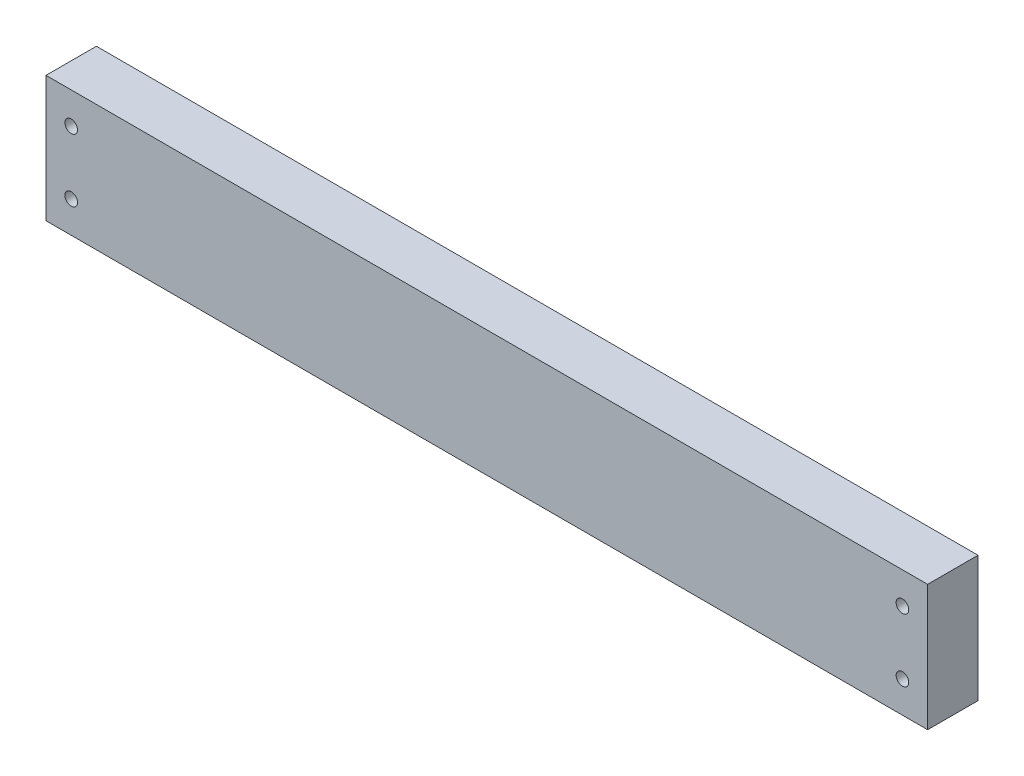
ISO-10303-21;
HEADER;
FILE_DESCRIPTION(('STEP AP214'),'2;1');
FILE_NAME('part.step','',(''),(''),'','','');
FILE_SCHEMA(('AUTOMOTIVE_DESIGN { 1 0 10303 214 1 1 1 1 }'));
ENDSEC;
DATA;
#1=APPLICATION_CONTEXT('core data for automotive mechanical design processes');
#2=APPLICATION_PROTOCOL_DEFINITION('international standard','automotive_design',2000,#1);
#3=PRODUCT_CONTEXT('',#1,'mechanical');
#4=PRODUCT('Part','Part','',(#3));
#5=PRODUCT_RELATED_PRODUCT_CATEGORY('part','',(#4));
#6=PRODUCT_DEFINITION_FORMATION('','',#4);
#7=PRODUCT_DEFINITION_CONTEXT('part definition',#1,'design');
#8=PRODUCT_DEFINITION('design','',#6,#7);
#9=PRODUCT_DEFINITION_SHAPE('','',#8);
#10=(LENGTH_UNIT() NAMED_UNIT(*) SI_UNIT(.MILLI.,.METRE.));
#11=(NAMED_UNIT(*) PLANE_ANGLE_UNIT() SI_UNIT($,.RADIAN.));
#12=(NAMED_UNIT(*) SI_UNIT($,.STERADIAN.) SOLID_ANGLE_UNIT());
#13=UNCERTAINTY_MEASURE_WITH_UNIT(LENGTH_MEASURE(1.E-05),#10,'distance_accuracy_value','');
#14=(GEOMETRIC_REPRESENTATION_CONTEXT(3) GLOBAL_UNCERTAINTY_ASSIGNED_CONTEXT((#13)) GLOBAL_UNIT_ASSIGNED_CONTEXT((#10,
#11,#12)) REPRESENTATION_CONTEXT('',''));
#15=CARTESIAN_POINT('',(0.,0.,0.));
#16=DIRECTION('',(0.,0.,1.));
#17=DIRECTION('',(1.,0.,0.));
#18=AXIS2_PLACEMENT_3D('',#15,#16,#17);
#19=CARTESIAN_POINT('',(350.,25.,-10.));
#20=DIRECTION('',(0.,0.,1.));
#21=DIRECTION('',(0.,-1.,0.));
#22=AXIS2_PLACEMENT_3D('',#19,#20,#21);
#23=PLANE('',#22);
#24=CARTESIAN_POINT('',(10.,12.5,-10.));
#25=DIRECTION('',(0.,0.,1.));
#26=DIRECTION('',(1.,0.,0.));
#27=AXIS2_PLACEMENT_3D('',#24,#25,#26);
#28=CIRCLE('',#27,2.5);
#29=CARTESIAN_POINT('',(12.5,12.5,-10.));
#30=VERTEX_POINT('',#29);
#31=EDGE_CURVE('E112',#30,#30,#28,.T.);
#32=ORIENTED_EDGE('',*,*,#31,.T.);
#33=EDGE_LOOP('',(#32));
#34=FACE_BOUND('',#33,.T.);
#35=CARTESIAN_POINT('',(340.,-12.5,-10.));
#36=DIRECTION('',(0.,0.,1.));
#37=DIRECTION('',(1.,0.,0.));
#38=AXIS2_PLACEMENT_3D('',#35,#36,#37);
#39=CIRCLE('',#38,2.50000000000002);
#40=CARTESIAN_POINT('',(342.5,-12.5,-10.));
#41=VERTEX_POINT('',#40);
#42=EDGE_CURVE('E124',#41,#41,#39,.T.);
#43=ORIENTED_EDGE('',*,*,#42,.T.);
#44=EDGE_LOOP('',(#43));
#45=FACE_BOUND('',#44,.T.);
#46=CARTESIAN_POINT('',(340.,12.5,-10.));
#47=DIRECTION('',(0.,0.,1.));
#48=DIRECTION('',(1.,0.,0.));
#49=AXIS2_PLACEMENT_3D('',#46,#47,#48);
#50=CIRCLE('',#49,2.50000000000002);
#51=CARTESIAN_POINT('',(342.5,12.5,-10.));
#52=VERTEX_POINT('',#51);
#53=EDGE_CURVE('E118',#52,#52,#50,.T.);
#54=ORIENTED_EDGE('',*,*,#53,.T.);
#55=EDGE_LOOP('',(#54));
#56=FACE_BOUND('',#55,.T.);
#57=CARTESIAN_POINT('',(10.,-12.5,-10.));
#58=DIRECTION('',(0.,0.,1.));
#59=DIRECTION('',(1.,0.,0.));
#60=AXIS2_PLACEMENT_3D('',#57,#58,#59);
#61=CIRCLE('',#60,2.5);
#62=CARTESIAN_POINT('',(12.5,-12.5,-10.));
#63=VERTEX_POINT('',#62);
#64=EDGE_CURVE('E98',#63,#63,#61,.T.);
#65=ORIENTED_EDGE('',*,*,#64,.T.);
#66=EDGE_LOOP('',(#65));
#67=FACE_BOUND('',#66,.T.);
#68=DIRECTION('',(0.,1.,0.));
#69=VECTOR('',#68,1.);
#70=CARTESIAN_POINT('',(0.,25.,-10.));
#71=LINE('',#70,#69);
#72=CARTESIAN_POINT('',(0.,-25.,-10.));
#73=VERTEX_POINT('',#72);
#74=CARTESIAN_POINT('',(0.,25.,-10.));
#75=VERTEX_POINT('',#74);
#76=EDGE_CURVE('E95',#73,#75,#71,.T.);
#77=ORIENTED_EDGE('',*,*,#76,.T.);
#78=DIRECTION('',(-1.,0.,0.));
#79=VECTOR('',#78,1.);
#80=CARTESIAN_POINT('',(350.,25.,-10.));
#81=LINE('',#80,#79);
#82=CARTESIAN_POINT('',(350.,25.,-10.));
#83=VERTEX_POINT('',#82);
#84=EDGE_CURVE('E11',#83,#75,#81,.T.);
#85=ORIENTED_EDGE('',*,*,#84,.F.);
#86=DIRECTION('',(0.,1.,0.));
#87=VECTOR('',#86,1.);
#88=CARTESIAN_POINT('',(350.,25.,-10.));
#89=LINE('',#88,#87);
#90=CARTESIAN_POINT('',(350.,-25.,-10.));
#91=VERTEX_POINT('',#90);
#92=EDGE_CURVE('E83',#91,#83,#89,.T.);
#93=ORIENTED_EDGE('',*,*,#92,.F.);
#94=DIRECTION('',(-1.,0.,0.));
#95=VECTOR('',#94,1.);
#96=CARTESIAN_POINT('',(350.,-25.,-10.));
#97=LINE('',#96,#95);
#98=EDGE_CURVE('E91',#91,#73,#97,.T.);
#99=ORIENTED_EDGE('',*,*,#98,.T.);
#100=EDGE_LOOP('',(#77,#85,#93,#99));
#101=FACE_BOUND('',#100,.T.);
#102=ADVANCED_FACE('F32',(#34,#45,#56,#67,#101),#23,.F.);
#103=CARTESIAN_POINT('',(350.,25.,10.));
#104=DIRECTION('',(0.,-1.,0.));
#105=DIRECTION('',(0.,0.,-1.));
#106=AXIS2_PLACEMENT_3D('',#103,#104,#105);
#107=PLANE('',#106);
#108=DIRECTION('',(0.,0.,1.));
#109=VECTOR('',#108,1.);
#110=CARTESIAN_POINT('',(0.,25.,10.));
#111=LINE('',#110,#109);
#112=CARTESIAN_POINT('',(0.,25.,10.));
#113=VERTEX_POINT('',#112);
#114=EDGE_CURVE('E87',#75,#113,#111,.T.);
#115=ORIENTED_EDGE('',*,*,#114,.T.);
#116=DIRECTION('',(-1.,0.,0.));
#117=VECTOR('',#116,1.);
#118=CARTESIAN_POINT('',(350.,25.,10.));
#119=LINE('',#118,#117);
#120=CARTESIAN_POINT('',(350.,25.,10.));
#121=VERTEX_POINT('',#120);
#122=EDGE_CURVE('E40',#121,#113,#119,.T.);
#123=ORIENTED_EDGE('',*,*,#122,.F.);
#124=DIRECTION('',(0.,0.,1.));
#125=VECTOR('',#124,1.);
#126=CARTESIAN_POINT('',(350.,25.,10.));
#127=LINE('',#126,#125);
#128=EDGE_CURVE('E78',#83,#121,#127,.T.);
#129=ORIENTED_EDGE('',*,*,#128,.F.);
#130=ORIENTED_EDGE('',*,*,#84,.T.);
#131=EDGE_LOOP('',(#115,#123,#129,#130));
#132=FACE_BOUND('',#131,.T.);
#133=ADVANCED_FACE('F86',(#132),#107,.F.);
#134=CARTESIAN_POINT('',(350.,25.,10.));
#135=DIRECTION('',(0.,0.,-1.));
#136=DIRECTION('',(0.,1.,0.));
#137=AXIS2_PLACEMENT_3D('',#134,#135,#136);
#138=PLANE('',#137);
#139=CARTESIAN_POINT('',(10.,12.5,10.));
#140=DIRECTION('',(0.,0.,1.));
#141=DIRECTION('',(1.,0.,0.));
#142=AXIS2_PLACEMENT_3D('',#139,#140,#141);
#143=CIRCLE('',#142,2.5);
#144=CARTESIAN_POINT('',(12.5,12.5,10.));
#145=VERTEX_POINT('',#144);
#146=EDGE_CURVE('E127',#145,#145,#143,.T.);
#147=ORIENTED_EDGE('',*,*,#146,.F.);
#148=EDGE_LOOP('',(#147));
#149=FACE_BOUND('',#148,.T.);
#150=CARTESIAN_POINT('',(340.,-12.5,10.));
#151=DIRECTION('',(0.,0.,1.));
#152=DIRECTION('',(1.,0.,0.));
#153=AXIS2_PLACEMENT_3D('',#150,#151,#152);
#154=CIRCLE('',#153,2.50000000000002);
#155=CARTESIAN_POINT('',(342.5,-12.5,10.));
#156=VERTEX_POINT('',#155);
#157=EDGE_CURVE('E121',#156,#156,#154,.T.);
#158=ORIENTED_EDGE('',*,*,#157,.F.);
#159=EDGE_LOOP('',(#158));
#160=FACE_BOUND('',#159,.T.);
#161=CARTESIAN_POINT('',(340.,12.5,10.));
#162=DIRECTION('',(0.,0.,1.));
#163=DIRECTION('',(1.,0.,0.));
#164=AXIS2_PLACEMENT_3D('',#161,#162,#163);
#165=CIRCLE('',#164,2.50000000000002);
#166=CARTESIAN_POINT('',(342.5,12.5,10.));
#167=VERTEX_POINT('',#166);
#168=EDGE_CURVE('E115',#167,#167,#165,.T.);
#169=ORIENTED_EDGE('',*,*,#168,.F.);
#170=EDGE_LOOP('',(#169));
#171=FACE_BOUND('',#170,.T.);
#172=CARTESIAN_POINT('',(10.,-12.5,10.));
#173=DIRECTION('',(0.,0.,1.));
#174=DIRECTION('',(1.,0.,0.));
#175=AXIS2_PLACEMENT_3D('',#172,#173,#174);
#176=CIRCLE('',#175,2.5);
#177=CARTESIAN_POINT('',(12.5,-12.5,10.));
#178=VERTEX_POINT('',#177);
#179=EDGE_CURVE('E109',#178,#178,#176,.T.);
#180=ORIENTED_EDGE('',*,*,#179,.F.);
#181=EDGE_LOOP('',(#180));
#182=FACE_BOUND('',#181,.T.);
#183=DIRECTION('',(0.,-1.,0.));
#184=VECTOR('',#183,1.);
#185=CARTESIAN_POINT('',(0.,25.,10.));
#186=LINE('',#185,#184);
#187=CARTESIAN_POINT('',(0.,-25.,9.99999999999999));
#188=VERTEX_POINT('',#187);
#189=EDGE_CURVE('E65',#113,#188,#186,.T.);
#190=ORIENTED_EDGE('',*,*,#189,.T.);
#191=DIRECTION('',(-1.,0.,0.));
#192=VECTOR('',#191,1.);
#193=CARTESIAN_POINT('',(350.,-25.,9.99999999999999));
#194=LINE('',#193,#192);
#195=CARTESIAN_POINT('',(350.,-25.,9.99999999999999));
#196=VERTEX_POINT('',#195);
#197=EDGE_CURVE('E88',#196,#188,#194,.T.);
#198=ORIENTED_EDGE('',*,*,#197,.F.);
#199=DIRECTION('',(0.,-1.,0.));
#200=VECTOR('',#199,1.);
#201=CARTESIAN_POINT('',(350.,25.,10.));
#202=LINE('',#201,#200);
#203=EDGE_CURVE('E81',#121,#196,#202,.T.);
#204=ORIENTED_EDGE('',*,*,#203,.F.);
#205=ORIENTED_EDGE('',*,*,#122,.T.);
#206=EDGE_LOOP('',(#190,#198,#204,#205));
#207=FACE_BOUND('',#206,.T.);
#208=ADVANCED_FACE('F89',(#149,#160,#171,#182,#207),#138,.F.);
#209=CARTESIAN_POINT('',(350.,-25.,9.99999999999999));
#210=DIRECTION('',(0.,1.,0.));
#211=DIRECTION('',(0.,0.,1.));
#212=AXIS2_PLACEMENT_3D('',#209,#210,#211);
#213=PLANE('',#212);
#214=DIRECTION('',(0.,0.,-1.));
#215=VECTOR('',#214,1.);
#216=CARTESIAN_POINT('',(0.,-25.,9.99999999999999));
#217=LINE('',#216,#215);
#218=EDGE_CURVE('E71',#188,#73,#217,.T.);
#219=ORIENTED_EDGE('',*,*,#218,.T.);
#220=ORIENTED_EDGE('',*,*,#98,.F.);
#221=DIRECTION('',(0.,0.,-1.));
#222=VECTOR('',#221,1.);
#223=CARTESIAN_POINT('',(350.,-25.,9.99999999999999));
#224=LINE('',#223,#222);
#225=EDGE_CURVE('E48',#196,#91,#224,.T.);
#226=ORIENTED_EDGE('',*,*,#225,.F.);
#227=ORIENTED_EDGE('',*,*,#197,.T.);
#228=EDGE_LOOP('',(#219,#220,#226,#227));
#229=FACE_BOUND('',#228,.T.);
#230=ADVANCED_FACE('F103',(#229),#213,.F.);
#231=CARTESIAN_POINT('',(350.,0.,0.));
#232=DIRECTION('',(1.,0.,0.));
#233=DIRECTION('',(0.,0.,-1.));
#234=AXIS2_PLACEMENT_3D('',#231,#232,#233);
#235=PLANE('',#234);
#236=ORIENTED_EDGE('',*,*,#92,.T.);
#237=ORIENTED_EDGE('',*,*,#128,.T.);
#238=ORIENTED_EDGE('',*,*,#203,.T.);
#239=ORIENTED_EDGE('',*,*,#225,.T.);
#240=EDGE_LOOP('',(#236,#237,#238,#239));
#241=FACE_BOUND('',#240,.T.);
#242=ADVANCED_FACE('F79',(#241),#235,.T.);
#243=CARTESIAN_POINT('',(0.,0.,0.));
#244=DIRECTION('',(1.,0.,0.));
#245=DIRECTION('',(0.,0.,-1.));
#246=AXIS2_PLACEMENT_3D('',#243,#244,#245);
#247=PLANE('',#246);
#248=ORIENTED_EDGE('',*,*,#76,.F.);
#249=ORIENTED_EDGE('',*,*,#218,.F.);
#250=ORIENTED_EDGE('',*,*,#189,.F.);
#251=ORIENTED_EDGE('',*,*,#114,.F.);
#252=EDGE_LOOP('',(#248,#249,#250,#251));
#253=FACE_BOUND('',#252,.T.);
#254=ADVANCED_FACE('F106',(#253),#247,.F.);
#255=CARTESIAN_POINT('',(10.,-12.5,-10.));
#256=DIRECTION('',(0.,0.,1.));
#257=DIRECTION('',(1.,0.,0.));
#258=AXIS2_PLACEMENT_3D('',#255,#256,#257);
#259=CYLINDRICAL_SURFACE('',#258,2.5);
#260=ORIENTED_EDGE('',*,*,#64,.F.);
#261=EDGE_LOOP('',(#260));
#262=FACE_BOUND('',#261,.T.);
#263=ORIENTED_EDGE('',*,*,#179,.T.);
#264=EDGE_LOOP('',(#263));
#265=FACE_BOUND('',#264,.T.);
#266=ADVANCED_FACE('F151',(#262,#265),#259,.F.);
#267=CARTESIAN_POINT('',(340.,12.5,-10.));
#268=DIRECTION('',(0.,0.,1.));
#269=DIRECTION('',(1.,0.,0.));
#270=AXIS2_PLACEMENT_3D('',#267,#268,#269);
#271=CYLINDRICAL_SURFACE('',#270,2.50000000000002);
#272=ORIENTED_EDGE('',*,*,#53,.F.);
#273=EDGE_LOOP('',(#272));
#274=FACE_BOUND('',#273,.T.);
#275=ORIENTED_EDGE('',*,*,#168,.T.);
#276=EDGE_LOOP('',(#275));
#277=FACE_BOUND('',#276,.T.);
#278=ADVANCED_FACE('F153',(#274,#277),#271,.F.);
#279=CARTESIAN_POINT('',(340.,-12.5,-10.));
#280=DIRECTION('',(0.,0.,1.));
#281=DIRECTION('',(1.,0.,0.));
#282=AXIS2_PLACEMENT_3D('',#279,#280,#281);
#283=CYLINDRICAL_SURFACE('',#282,2.50000000000002);
#284=ORIENTED_EDGE('',*,*,#42,.F.);
#285=EDGE_LOOP('',(#284));
#286=FACE_BOUND('',#285,.T.);
#287=ORIENTED_EDGE('',*,*,#157,.T.);
#288=EDGE_LOOP('',(#287));
#289=FACE_BOUND('',#288,.T.);
#290=ADVANCED_FACE('F138',(#286,#289),#283,.F.);
#291=CARTESIAN_POINT('',(10.,12.5,-10.));
#292=DIRECTION('',(0.,0.,1.));
#293=DIRECTION('',(1.,0.,0.));
#294=AXIS2_PLACEMENT_3D('',#291,#292,#293);
#295=CYLINDRICAL_SURFACE('',#294,2.5);
#296=ORIENTED_EDGE('',*,*,#31,.F.);
#297=EDGE_LOOP('',(#296));
#298=FACE_BOUND('',#297,.T.);
#299=ORIENTED_EDGE('',*,*,#146,.T.);
#300=EDGE_LOOP('',(#299));
#301=FACE_BOUND('',#300,.T.);
#302=ADVANCED_FACE('F135',(#298,#301),#295,.F.);
#303=CLOSED_SHELL('',(#102,#133,#208,#230,#242,#254,#266,#278,#290,#302));
#304=MANIFOLD_SOLID_BREP('B2',#303);
#305=ADVANCED_BREP_SHAPE_REPRESENTATION('',(#18,#304),#14);
#306=SHAPE_DEFINITION_REPRESENTATION(#9,#305);
ENDSEC;
END-ISO-10303-21;
